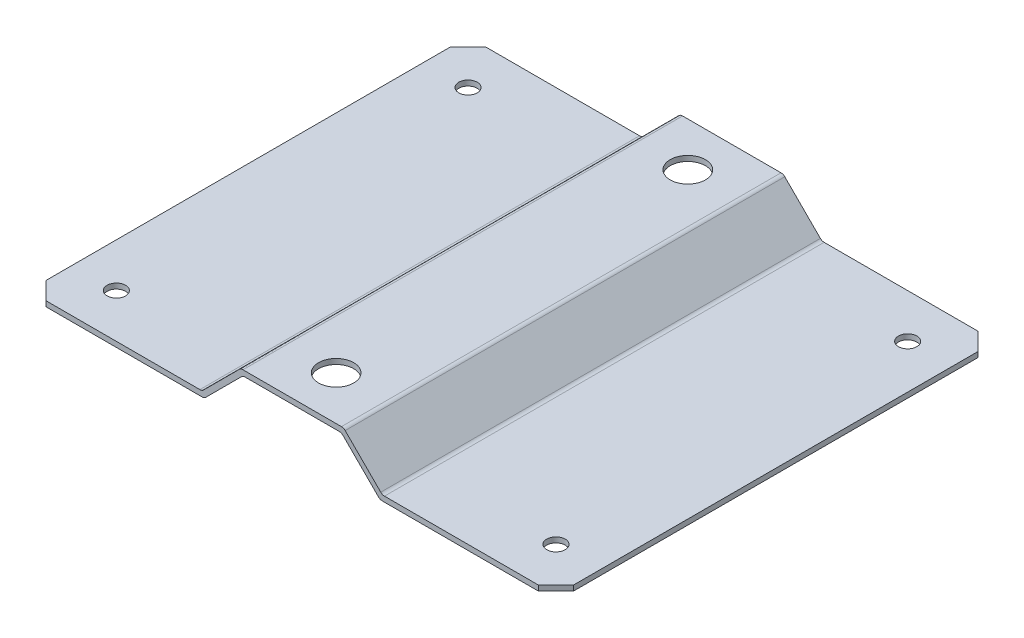
ISO-10303-21;
HEADER;
FILE_DESCRIPTION(('STEP AP214'),'2;1');
FILE_NAME('part.step','',(''),(''),'','','');
FILE_SCHEMA(('AUTOMOTIVE_DESIGN { 1 0 10303 214 1 1 1 1 }'));
ENDSEC;
DATA;
#1=APPLICATION_CONTEXT('core data for automotive mechanical design processes');
#2=APPLICATION_PROTOCOL_DEFINITION('international standard','automotive_design',2000,#1);
#3=PRODUCT_CONTEXT('',#1,'mechanical');
#4=PRODUCT('Part','Part','',(#3));
#5=PRODUCT_RELATED_PRODUCT_CATEGORY('part','',(#4));
#6=PRODUCT_DEFINITION_FORMATION('','',#4);
#7=PRODUCT_DEFINITION_CONTEXT('part definition',#1,'design');
#8=PRODUCT_DEFINITION('design','',#6,#7);
#9=PRODUCT_DEFINITION_SHAPE('','',#8);
#10=(LENGTH_UNIT() NAMED_UNIT(*) SI_UNIT(.MILLI.,.METRE.));
#11=(NAMED_UNIT(*) PLANE_ANGLE_UNIT() SI_UNIT($,.RADIAN.));
#12=(NAMED_UNIT(*) SI_UNIT($,.STERADIAN.) SOLID_ANGLE_UNIT());
#13=UNCERTAINTY_MEASURE_WITH_UNIT(LENGTH_MEASURE(1.E-05),#10,'distance_accuracy_value','');
#14=(GEOMETRIC_REPRESENTATION_CONTEXT(3) GLOBAL_UNCERTAINTY_ASSIGNED_CONTEXT((#13)) GLOBAL_UNIT_ASSIGNED_CONTEXT((#10,
#11,#12)) REPRESENTATION_CONTEXT('',''));
#15=CARTESIAN_POINT('',(0.,0.,0.));
#16=DIRECTION('',(0.,0.,1.));
#17=DIRECTION('',(1.,0.,0.));
#18=AXIS2_PLACEMENT_3D('',#15,#16,#17);
#19=CARTESIAN_POINT('',(0.,3.,250.));
#20=DIRECTION('',(1.,0.,0.));
#21=DIRECTION('',(0.,0.,-1.));
#22=AXIS2_PLACEMENT_3D('',#19,#20,#21);
#23=PLANE('',#22);
#24=DIRECTION('',(0.,0.,-1.));
#25=VECTOR('',#24,1.);
#26=CARTESIAN_POINT('',(0.,3.,250.));
#27=LINE('',#26,#25);
#28=CARTESIAN_POINT('',(0.,3.,240.));
#29=VERTEX_POINT('',#28);
#30=CARTESIAN_POINT('',(0.,3.,10.));
#31=VERTEX_POINT('',#30);
#32=EDGE_CURVE('E247',#29,#31,#27,.T.);
#33=ORIENTED_EDGE('',*,*,#32,.T.);
#34=DIRECTION('',(0.,-1.,0.));
#35=VECTOR('',#34,1.);
#36=CARTESIAN_POINT('',(0.,3.,10.));
#37=LINE('',#36,#35);
#38=CARTESIAN_POINT('',(0.,0.,10.));
#39=VERTEX_POINT('',#38);
#40=EDGE_CURVE('E349',#31,#39,#37,.T.);
#41=ORIENTED_EDGE('',*,*,#40,.T.);
#42=DIRECTION('',(0.,0.,-1.));
#43=VECTOR('',#42,1.);
#44=CARTESIAN_POINT('',(0.,0.,250.));
#45=LINE('',#44,#43);
#46=CARTESIAN_POINT('',(0.,0.,240.));
#47=VERTEX_POINT('',#46);
#48=EDGE_CURVE('E220',#47,#39,#45,.T.);
#49=ORIENTED_EDGE('',*,*,#48,.F.);
#50=DIRECTION('',(0.,1.,0.));
#51=VECTOR('',#50,1.);
#52=CARTESIAN_POINT('',(0.,3.,240.));
#53=LINE('',#52,#51);
#54=EDGE_CURVE('E347',#47,#29,#53,.T.);
#55=ORIENTED_EDGE('',*,*,#54,.T.);
#56=EDGE_LOOP('',(#33,#41,#49,#55));
#57=FACE_BOUND('',#56,.T.);
#58=ADVANCED_FACE('F35',(#57),#23,.F.);
#59=CARTESIAN_POINT('',(0.,0.,250.));
#60=DIRECTION('',(0.,1.,0.));
#61=DIRECTION('',(-1.,0.,0.));
#62=AXIS2_PLACEMENT_3D('',#59,#60,#61);
#63=PLANE('',#62);
#64=CARTESIAN_POINT('',(25.,0.,225.));
#65=DIRECTION('',(0.,-1.,0.));
#66=DIRECTION('',(0.,0.,-1.));
#67=AXIS2_PLACEMENT_3D('',#64,#65,#66);
#68=CIRCLE('',#67,5.25);
#69=CARTESIAN_POINT('',(25.,0.,219.75));
#70=VERTEX_POINT('',#69);
#71=EDGE_CURVE('E440',#70,#70,#68,.T.);
#72=ORIENTED_EDGE('',*,*,#71,.F.);
#73=EDGE_LOOP('',(#72));
#74=FACE_BOUND('',#73,.T.);
#75=CARTESIAN_POINT('',(25.,0.,25.));
#76=DIRECTION('',(0.,-1.,0.));
#77=DIRECTION('',(0.,0.,-1.));
#78=AXIS2_PLACEMENT_3D('',#75,#76,#77);
#79=CIRCLE('',#78,5.25);
#80=CARTESIAN_POINT('',(25.,0.,19.75));
#81=VERTEX_POINT('',#80);
#82=EDGE_CURVE('E434',#81,#81,#79,.T.);
#83=ORIENTED_EDGE('',*,*,#82,.F.);
#84=EDGE_LOOP('',(#83));
#85=FACE_BOUND('',#84,.T.);
#86=ORIENTED_EDGE('',*,*,#48,.T.);
#87=DIRECTION('',(-0.707106781186549,0.,0.707106781186546));
#88=VECTOR('',#87,1.);
#89=CARTESIAN_POINT('',(0.,0.,10.));
#90=LINE('',#89,#88);
#91=CARTESIAN_POINT('',(10.0000000000001,0.,0.));
#92=VERTEX_POINT('',#91);
#93=EDGE_CURVE('E353',#39,#92,#90,.F.);
#94=ORIENTED_EDGE('',*,*,#93,.T.);
#95=DIRECTION('',(1.,0.,0.));
#96=VECTOR('',#95,1.);
#97=CARTESIAN_POINT('',(0.,0.,0.));
#98=LINE('',#97,#96);
#99=CARTESIAN_POINT('',(98.7573593128807,0.,0.));
#100=VERTEX_POINT('',#99);
#101=EDGE_CURVE('E385',#92,#100,#98,.T.);
#102=ORIENTED_EDGE('',*,*,#101,.T.);
#103=DIRECTION('',(0.,0.,-1.));
#104=VECTOR('',#103,1.);
#105=CARTESIAN_POINT('',(98.7573593128807,0.,250.));
#106=LINE('',#105,#104);
#107=CARTESIAN_POINT('',(98.7573593128807,0.,250.));
#108=VERTEX_POINT('',#107);
#109=EDGE_CURVE('E290',#100,#108,#106,.F.);
#110=ORIENTED_EDGE('',*,*,#109,.T.);
#111=DIRECTION('',(1.,0.,0.));
#112=VECTOR('',#111,1.);
#113=CARTESIAN_POINT('',(0.,0.,250.));
#114=LINE('',#113,#112);
#115=CARTESIAN_POINT('',(10.,0.,250.));
#116=VERTEX_POINT('',#115);
#117=EDGE_CURVE('E246',#116,#108,#114,.T.);
#118=ORIENTED_EDGE('',*,*,#117,.F.);
#119=DIRECTION('',(-0.707106781186546,0.,-0.707106781186549));
#120=VECTOR('',#119,1.);
#121=CARTESIAN_POINT('',(10.,0.,250.));
#122=LINE('',#121,#120);
#123=EDGE_CURVE('E58',#116,#47,#122,.T.);
#124=ORIENTED_EDGE('',*,*,#123,.T.);
#125=EDGE_LOOP('',(#86,#94,#102,#110,#118,#124));
#126=FACE_BOUND('',#125,.T.);
#127=ADVANCED_FACE('F447',(#74,#85,#126),#63,.F.);
#128=CARTESIAN_POINT('',(100.,0.,250.));
#129=DIRECTION('',(-0.707106781186549,0.707106781186546,0.));
#130=DIRECTION('',(-0.707106781186546,-0.707106781186549,0.));
#131=AXIS2_PLACEMENT_3D('',#128,#129,#130);
#132=PLANE('',#131);
#133=DIRECTION('',(0.707106781186546,0.707106781186549,0.));
#134=VECTOR('',#133,1.);
#135=CARTESIAN_POINT('',(100.,0.,0.));
#136=LINE('',#135,#134);
#137=CARTESIAN_POINT('',(100.87867965644,0.878679656440359,0.));
#138=VERTEX_POINT('',#137);
#139=CARTESIAN_POINT('',(121.12132034356,21.1213203435596,0.));
#140=VERTEX_POINT('',#139);
#141=EDGE_CURVE('E387',#138,#140,#136,.T.);
#142=ORIENTED_EDGE('',*,*,#141,.T.);
#143=DIRECTION('',(0.,0.,-1.));
#144=VECTOR('',#143,1.);
#145=CARTESIAN_POINT('',(121.12132034356,21.1213203435596,250.));
#146=LINE('',#145,#144);
#147=CARTESIAN_POINT('',(121.12132034356,21.1213203435596,250.));
#148=VERTEX_POINT('',#147);
#149=EDGE_CURVE('E288',#140,#148,#146,.F.);
#150=ORIENTED_EDGE('',*,*,#149,.T.);
#151=DIRECTION('',(0.707106781186546,0.707106781186549,0.));
#152=VECTOR('',#151,1.);
#153=CARTESIAN_POINT('',(100.,0.,250.));
#154=LINE('',#153,#152);
#155=CARTESIAN_POINT('',(100.87867965644,0.878679656440359,250.));
#156=VERTEX_POINT('',#155);
#157=EDGE_CURVE('E407',#156,#148,#154,.T.);
#158=ORIENTED_EDGE('',*,*,#157,.F.);
#159=DIRECTION('',(0.,0.,-1.));
#160=VECTOR('',#159,1.);
#161=CARTESIAN_POINT('',(100.87867965644,0.878679656440359,250.));
#162=LINE('',#161,#160);
#163=EDGE_CURVE('E285',#156,#138,#162,.T.);
#164=ORIENTED_EDGE('',*,*,#163,.T.);
#165=EDGE_LOOP('',(#142,#150,#158,#164));
#166=FACE_BOUND('',#165,.T.);
#167=ADVANCED_FACE('F450',(#166),#132,.F.);
#168=CARTESIAN_POINT('',(122.,22.,250.));
#169=DIRECTION('',(0.,1.,0.));
#170=DIRECTION('',(0.,0.,1.));
#171=AXIS2_PLACEMENT_3D('',#168,#169,#170);
#172=PLANE('',#171);
#173=CARTESIAN_POINT('',(150.,22.,225.));
#174=DIRECTION('',(0.,-1.,0.));
#175=DIRECTION('',(0.,0.,-1.));
#176=AXIS2_PLACEMENT_3D('',#173,#174,#175);
#177=CIRCLE('',#176,9.99999999999998);
#178=CARTESIAN_POINT('',(150.,22.,215.));
#179=VERTEX_POINT('',#178);
#180=EDGE_CURVE('E262',#179,#179,#177,.T.);
#181=ORIENTED_EDGE('',*,*,#180,.F.);
#182=EDGE_LOOP('',(#181));
#183=FACE_BOUND('',#182,.T.);
#184=CARTESIAN_POINT('',(150.,22.,25.));
#185=DIRECTION('',(0.,-1.,0.));
#186=DIRECTION('',(0.,0.,-1.));
#187=AXIS2_PLACEMENT_3D('',#184,#185,#186);
#188=CIRCLE('',#187,9.99999999999998);
#189=CARTESIAN_POINT('',(150.,22.,15.));
#190=VERTEX_POINT('',#189);
#191=EDGE_CURVE('E261',#190,#190,#188,.T.);
#192=ORIENTED_EDGE('',*,*,#191,.F.);
#193=EDGE_LOOP('',(#192));
#194=FACE_BOUND('',#193,.T.);
#195=DIRECTION('',(1.,0.,0.));
#196=VECTOR('',#195,1.);
#197=CARTESIAN_POINT('',(122.,22.,0.));
#198=LINE('',#197,#196);
#199=CARTESIAN_POINT('',(123.242640687119,22.,0.));
#200=VERTEX_POINT('',#199);
#201=CARTESIAN_POINT('',(176.757359312881,22.,0.));
#202=VERTEX_POINT('',#201);
#203=EDGE_CURVE('E231',#200,#202,#198,.T.);
#204=ORIENTED_EDGE('',*,*,#203,.T.);
#205=DIRECTION('',(0.,0.,-1.));
#206=VECTOR('',#205,1.);
#207=CARTESIAN_POINT('',(176.757359312881,22.,250.));
#208=LINE('',#207,#206);
#209=CARTESIAN_POINT('',(176.757359312881,22.,250.));
#210=VERTEX_POINT('',#209);
#211=EDGE_CURVE('E283',#202,#210,#208,.F.);
#212=ORIENTED_EDGE('',*,*,#211,.T.);
#213=DIRECTION('',(1.,0.,0.));
#214=VECTOR('',#213,1.);
#215=CARTESIAN_POINT('',(122.,22.,250.));
#216=LINE('',#215,#214);
#217=CARTESIAN_POINT('',(123.242640687119,22.,250.));
#218=VERTEX_POINT('',#217);
#219=EDGE_CURVE('E404',#218,#210,#216,.T.);
#220=ORIENTED_EDGE('',*,*,#219,.F.);
#221=DIRECTION('',(0.,0.,-1.));
#222=VECTOR('',#221,1.);
#223=CARTESIAN_POINT('',(123.242640687119,22.,0.));
#224=LINE('',#223,#222);
#225=EDGE_CURVE('E280',#218,#200,#224,.T.);
#226=ORIENTED_EDGE('',*,*,#225,.T.);
#227=EDGE_LOOP('',(#204,#212,#220,#226));
#228=FACE_BOUND('',#227,.T.);
#229=ADVANCED_FACE('F394',(#183,#194,#228),#172,.F.);
#230=CARTESIAN_POINT('',(178.,22.,250.));
#231=DIRECTION('',(0.707106781186548,0.707106781186547,0.));
#232=DIRECTION('',(-0.707106781186547,0.707106781186548,0.));
#233=AXIS2_PLACEMENT_3D('',#230,#231,#232);
#234=PLANE('',#233);
#235=DIRECTION('',(0.707106781186547,-0.707106781186548,0.));
#236=VECTOR('',#235,1.);
#237=CARTESIAN_POINT('',(178.,22.,0.));
#238=LINE('',#237,#236);
#239=CARTESIAN_POINT('',(178.87867965644,21.1213203435596,0.));
#240=VERTEX_POINT('',#239);
#241=CARTESIAN_POINT('',(199.12132034356,0.878679656440361,0.));
#242=VERTEX_POINT('',#241);
#243=EDGE_CURVE('E227',#240,#242,#238,.T.);
#244=ORIENTED_EDGE('',*,*,#243,.T.);
#245=DIRECTION('',(0.,0.,-1.));
#246=VECTOR('',#245,1.);
#247=CARTESIAN_POINT('',(199.12132034356,0.878679656440368,250.));
#248=LINE('',#247,#246);
#249=CARTESIAN_POINT('',(199.12132034356,0.878679656440361,250.));
#250=VERTEX_POINT('',#249);
#251=EDGE_CURVE('E203',#242,#250,#248,.F.);
#252=ORIENTED_EDGE('',*,*,#251,.T.);
#253=DIRECTION('',(0.707106781186547,-0.707106781186548,0.));
#254=VECTOR('',#253,1.);
#255=CARTESIAN_POINT('',(178.,22.,250.));
#256=LINE('',#255,#254);
#257=CARTESIAN_POINT('',(178.87867965644,21.1213203435596,250.));
#258=VERTEX_POINT('',#257);
#259=EDGE_CURVE('E375',#258,#250,#256,.T.);
#260=ORIENTED_EDGE('',*,*,#259,.F.);
#261=DIRECTION('',(0.,0.,-1.));
#262=VECTOR('',#261,1.);
#263=CARTESIAN_POINT('',(178.87867965644,21.1213203435596,0.));
#264=LINE('',#263,#262);
#265=EDGE_CURVE('E208',#258,#240,#264,.T.);
#266=ORIENTED_EDGE('',*,*,#265,.T.);
#267=EDGE_LOOP('',(#244,#252,#260,#266));
#268=FACE_BOUND('',#267,.T.);
#269=ADVANCED_FACE('F406',(#268),#234,.F.);
#270=CARTESIAN_POINT('',(200.,0.,250.));
#271=DIRECTION('',(0.,1.,0.));
#272=DIRECTION('',(-1.,0.,0.));
#273=AXIS2_PLACEMENT_3D('',#270,#271,#272);
#274=PLANE('',#273);
#275=CARTESIAN_POINT('',(275.,0.,225.));
#276=DIRECTION('',(0.,-1.,0.));
#277=DIRECTION('',(0.,0.,-1.));
#278=AXIS2_PLACEMENT_3D('',#275,#276,#277);
#279=CIRCLE('',#278,5.24999999999998);
#280=CARTESIAN_POINT('',(275.,0.,219.75));
#281=VERTEX_POINT('',#280);
#282=EDGE_CURVE('E428',#281,#281,#279,.T.);
#283=ORIENTED_EDGE('',*,*,#282,.F.);
#284=EDGE_LOOP('',(#283));
#285=FACE_BOUND('',#284,.T.);
#286=CARTESIAN_POINT('',(275.,0.,25.));
#287=DIRECTION('',(0.,-1.,0.));
#288=DIRECTION('',(0.,0.,-1.));
#289=AXIS2_PLACEMENT_3D('',#286,#287,#288);
#290=CIRCLE('',#289,5.24999999999998);
#291=CARTESIAN_POINT('',(275.,0.,19.75));
#292=VERTEX_POINT('',#291);
#293=EDGE_CURVE('E422',#292,#292,#290,.T.);
#294=ORIENTED_EDGE('',*,*,#293,.F.);
#295=EDGE_LOOP('',(#294));
#296=FACE_BOUND('',#295,.T.);
#297=DIRECTION('',(1.,0.,0.));
#298=VECTOR('',#297,1.);
#299=CARTESIAN_POINT('',(200.,0.,0.));
#300=LINE('',#299,#298);
#301=CARTESIAN_POINT('',(201.242640687119,0.,0.));
#302=VERTEX_POINT('',#301);
#303=CARTESIAN_POINT('',(290.,0.,0.));
#304=VERTEX_POINT('',#303);
#305=EDGE_CURVE('E215',#302,#304,#300,.T.);
#306=ORIENTED_EDGE('',*,*,#305,.T.);
#307=DIRECTION('',(-0.707106781186549,0.,-0.707106781186546));
#308=VECTOR('',#307,1.);
#309=CARTESIAN_POINT('',(300.,0.,10.));
#310=LINE('',#309,#308);
#311=CARTESIAN_POINT('',(300.,0.,10.));
#312=VERTEX_POINT('',#311);
#313=EDGE_CURVE('E345',#304,#312,#310,.F.);
#314=ORIENTED_EDGE('',*,*,#313,.T.);
#315=DIRECTION('',(0.,0.,-1.));
#316=VECTOR('',#315,1.);
#317=CARTESIAN_POINT('',(300.,0.,250.));
#318=LINE('',#317,#316);
#319=CARTESIAN_POINT('',(300.,0.,240.));
#320=VERTEX_POINT('',#319);
#321=EDGE_CURVE('E254',#320,#312,#318,.T.);
#322=ORIENTED_EDGE('',*,*,#321,.F.);
#323=DIRECTION('',(-0.707106781186546,0.,0.707106781186549));
#324=VECTOR('',#323,1.);
#325=CARTESIAN_POINT('',(290.,0.,250.));
#326=LINE('',#325,#324);
#327=CARTESIAN_POINT('',(290.,0.,250.));
#328=VERTEX_POINT('',#327);
#329=EDGE_CURVE('E343',#320,#328,#326,.T.);
#330=ORIENTED_EDGE('',*,*,#329,.T.);
#331=DIRECTION('',(1.,0.,0.));
#332=VECTOR('',#331,1.);
#333=CARTESIAN_POINT('',(200.,0.,250.));
#334=LINE('',#333,#332);
#335=CARTESIAN_POINT('',(201.242640687119,0.,250.));
#336=VERTEX_POINT('',#335);
#337=EDGE_CURVE('E218',#336,#328,#334,.T.);
#338=ORIENTED_EDGE('',*,*,#337,.F.);
#339=DIRECTION('',(0.,0.,-1.));
#340=VECTOR('',#339,1.);
#341=CARTESIAN_POINT('',(201.242640687119,0.,250.));
#342=LINE('',#341,#340);
#343=EDGE_CURVE('E202',#336,#302,#342,.T.);
#344=ORIENTED_EDGE('',*,*,#343,.T.);
#345=EDGE_LOOP('',(#306,#314,#322,#330,#338,#344));
#346=FACE_BOUND('',#345,.T.);
#347=ADVANCED_FACE('F214',(#285,#296,#346),#274,.F.);
#348=CARTESIAN_POINT('',(300.,0.,250.));
#349=DIRECTION('',(-1.,0.,0.));
#350=DIRECTION('',(0.,0.,1.));
#351=AXIS2_PLACEMENT_3D('',#348,#349,#350);
#352=PLANE('',#351);
#353=ORIENTED_EDGE('',*,*,#321,.T.);
#354=DIRECTION('',(0.,1.,0.));
#355=VECTOR('',#354,1.);
#356=CARTESIAN_POINT('',(300.,0.,10.));
#357=LINE('',#356,#355);
#358=CARTESIAN_POINT('',(300.,3.00000000000001,10.));
#359=VERTEX_POINT('',#358);
#360=EDGE_CURVE('E333',#312,#359,#357,.T.);
#361=ORIENTED_EDGE('',*,*,#360,.T.);
#362=DIRECTION('',(0.,0.,-1.));
#363=VECTOR('',#362,1.);
#364=CARTESIAN_POINT('',(300.,3.00000000000001,250.));
#365=LINE('',#364,#363);
#366=CARTESIAN_POINT('',(300.,3.00000000000001,240.));
#367=VERTEX_POINT('',#366);
#368=EDGE_CURVE('E250',#367,#359,#365,.T.);
#369=ORIENTED_EDGE('',*,*,#368,.F.);
#370=DIRECTION('',(0.,-1.,0.));
#371=VECTOR('',#370,1.);
#372=CARTESIAN_POINT('',(300.,0.,240.));
#373=LINE('',#372,#371);
#374=EDGE_CURVE('E331',#367,#320,#373,.T.);
#375=ORIENTED_EDGE('',*,*,#374,.T.);
#376=EDGE_LOOP('',(#353,#361,#369,#375));
#377=FACE_BOUND('',#376,.T.);
#378=ADVANCED_FACE('F513',(#377),#352,.F.);
#379=CARTESIAN_POINT('',(300.,3.00000000000001,250.));
#380=DIRECTION('',(0.,-1.,0.));
#381=DIRECTION('',(1.,0.,0.));
#382=AXIS2_PLACEMENT_3D('',#379,#380,#381);
#383=PLANE('',#382);
#384=CARTESIAN_POINT('',(275.,3.00000000000001,225.));
#385=DIRECTION('',(0.,-1.,0.));
#386=DIRECTION('',(1.,0.,0.));
#387=AXIS2_PLACEMENT_3D('',#384,#385,#386);
#388=CIRCLE('',#387,5.24999999999998);
#389=CARTESIAN_POINT('',(280.25,3.00000000000001,225.));
#390=VERTEX_POINT('',#389);
#391=EDGE_CURVE('E425',#390,#390,#388,.T.);
#392=ORIENTED_EDGE('',*,*,#391,.T.);
#393=EDGE_LOOP('',(#392));
#394=FACE_BOUND('',#393,.T.);
#395=CARTESIAN_POINT('',(275.,3.00000000000001,25.));
#396=DIRECTION('',(0.,-1.,0.));
#397=DIRECTION('',(1.,0.,0.));
#398=AXIS2_PLACEMENT_3D('',#395,#396,#397);
#399=CIRCLE('',#398,5.24999999999998);
#400=CARTESIAN_POINT('',(280.25,3.00000000000001,25.));
#401=VERTEX_POINT('',#400);
#402=EDGE_CURVE('E419',#401,#401,#399,.T.);
#403=ORIENTED_EDGE('',*,*,#402,.T.);
#404=EDGE_LOOP('',(#403));
#405=FACE_BOUND('',#404,.T.);
#406=ORIENTED_EDGE('',*,*,#368,.T.);
#407=DIRECTION('',(0.707106781186549,0.,0.707106781186546));
#408=VECTOR('',#407,1.);
#409=CARTESIAN_POINT('',(300.,3.00000000000001,10.));
#410=LINE('',#409,#408);
#411=CARTESIAN_POINT('',(290.,3.00000000000001,0.));
#412=VERTEX_POINT('',#411);
#413=EDGE_CURVE('E338',#359,#412,#410,.F.);
#414=ORIENTED_EDGE('',*,*,#413,.T.);
#415=DIRECTION('',(-1.,0.,0.));
#416=VECTOR('',#415,1.);
#417=CARTESIAN_POINT('',(300.,3.00000000000001,0.));
#418=LINE('',#417,#416);
#419=CARTESIAN_POINT('',(202.485281374238,2.99999999999999,0.));
#420=VERTEX_POINT('',#419);
#421=EDGE_CURVE('E226',#412,#420,#418,.T.);
#422=ORIENTED_EDGE('',*,*,#421,.T.);
#423=DIRECTION('',(0.,0.,-1.));
#424=VECTOR('',#423,1.);
#425=CARTESIAN_POINT('',(202.485281374238,2.99999999999999,250.));
#426=LINE('',#425,#424);
#427=CARTESIAN_POINT('',(202.485281374238,2.99999999999999,250.));
#428=VERTEX_POINT('',#427);
#429=EDGE_CURVE('E298',#420,#428,#426,.F.);
#430=ORIENTED_EDGE('',*,*,#429,.T.);
#431=DIRECTION('',(-1.,0.,0.));
#432=VECTOR('',#431,1.);
#433=CARTESIAN_POINT('',(300.,3.00000000000001,250.));
#434=LINE('',#433,#432);
#435=CARTESIAN_POINT('',(290.,3.00000000000001,250.));
#436=VERTEX_POINT('',#435);
#437=EDGE_CURVE('E362',#436,#428,#434,.T.);
#438=ORIENTED_EDGE('',*,*,#437,.F.);
#439=DIRECTION('',(0.707106781186546,0.,-0.707106781186549));
#440=VECTOR('',#439,1.);
#441=CARTESIAN_POINT('',(290.,3.00000000000001,250.));
#442=LINE('',#441,#440);
#443=EDGE_CURVE('E336',#436,#367,#442,.T.);
#444=ORIENTED_EDGE('',*,*,#443,.T.);
#445=EDGE_LOOP('',(#406,#414,#422,#430,#438,#444));
#446=FACE_BOUND('',#445,.T.);
#447=ADVANCED_FACE('F366',(#394,#405,#446),#383,.F.);
#448=CARTESIAN_POINT('',(201.242640687119,2.99999999999999,250.));
#449=DIRECTION('',(-0.707106781186548,-0.707106781186547,0.));
#450=DIRECTION('',(0.707106781186547,-0.707106781186548,0.));
#451=AXIS2_PLACEMENT_3D('',#448,#449,#450);
#452=PLANE('',#451);
#453=DIRECTION('',(-0.707106781186547,0.707106781186548,0.));
#454=VECTOR('',#453,1.);
#455=CARTESIAN_POINT('',(201.242640687119,2.99999999999999,250.));
#456=LINE('',#455,#454);
#457=CARTESIAN_POINT('',(200.363961030679,3.87867965644036,250.));
#458=VERTEX_POINT('',#457);
#459=CARTESIAN_POINT('',(180.12132034356,24.1213203435596,250.));
#460=VERTEX_POINT('',#459);
#461=EDGE_CURVE('E370',#458,#460,#456,.T.);
#462=ORIENTED_EDGE('',*,*,#461,.F.);
#463=DIRECTION('',(0.,0.,-1.));
#464=VECTOR('',#463,1.);
#465=CARTESIAN_POINT('',(200.363961030679,3.87867965644036,0.));
#466=LINE('',#465,#464);
#467=CARTESIAN_POINT('',(200.363961030679,3.87867965644036,0.));
#468=VERTEX_POINT('',#467);
#469=EDGE_CURVE('E295',#458,#468,#466,.T.);
#470=ORIENTED_EDGE('',*,*,#469,.T.);
#471=DIRECTION('',(-0.707106781186547,0.707106781186548,0.));
#472=VECTOR('',#471,1.);
#473=CARTESIAN_POINT('',(201.242640687119,2.99999999999999,0.));
#474=LINE('',#473,#472);
#475=CARTESIAN_POINT('',(180.12132034356,24.1213203435596,0.));
#476=VERTEX_POINT('',#475);
#477=EDGE_CURVE('E229',#468,#476,#474,.T.);
#478=ORIENTED_EDGE('',*,*,#477,.T.);
#479=DIRECTION('',(0.,0.,-1.));
#480=VECTOR('',#479,1.);
#481=CARTESIAN_POINT('',(180.12132034356,24.1213203435596,250.));
#482=LINE('',#481,#480);
#483=EDGE_CURVE('E293',#476,#460,#482,.F.);
#484=ORIENTED_EDGE('',*,*,#483,.T.);
#485=EDGE_LOOP('',(#462,#470,#478,#484));
#486=FACE_BOUND('',#485,.T.);
#487=ADVANCED_FACE('F504',(#486),#452,.F.);
#488=CARTESIAN_POINT('',(179.242640687119,25.,250.));
#489=DIRECTION('',(0.,-1.,0.));
#490=DIRECTION('',(1.,0.,0.));
#491=AXIS2_PLACEMENT_3D('',#488,#489,#490);
#492=PLANE('',#491);
#493=CARTESIAN_POINT('',(150.,25.,225.));
#494=DIRECTION('',(0.,-1.,0.));
#495=DIRECTION('',(1.,0.,0.));
#496=AXIS2_PLACEMENT_3D('',#493,#494,#495);
#497=CIRCLE('',#496,9.99999999999998);
#498=CARTESIAN_POINT('',(160.,25.,225.));
#499=VERTEX_POINT('',#498);
#500=EDGE_CURVE('E259',#499,#499,#497,.T.);
#501=ORIENTED_EDGE('',*,*,#500,.T.);
#502=EDGE_LOOP('',(#501));
#503=FACE_BOUND('',#502,.T.);
#504=CARTESIAN_POINT('',(150.,25.,25.));
#505=DIRECTION('',(0.,-1.,0.));
#506=DIRECTION('',(1.,0.,0.));
#507=AXIS2_PLACEMENT_3D('',#504,#505,#506);
#508=CIRCLE('',#507,9.99999999999998);
#509=CARTESIAN_POINT('',(160.,25.,25.));
#510=VERTEX_POINT('',#509);
#511=EDGE_CURVE('E388',#510,#510,#508,.T.);
#512=ORIENTED_EDGE('',*,*,#511,.T.);
#513=EDGE_LOOP('',(#512));
#514=FACE_BOUND('',#513,.T.);
#515=DIRECTION('',(-1.,0.,0.));
#516=VECTOR('',#515,1.);
#517=CARTESIAN_POINT('',(179.242640687119,25.,250.));
#518=LINE('',#517,#516);
#519=CARTESIAN_POINT('',(178.,25.,250.));
#520=VERTEX_POINT('',#519);
#521=CARTESIAN_POINT('',(122.,25.,250.));
#522=VERTEX_POINT('',#521);
#523=EDGE_CURVE('E373',#520,#522,#518,.T.);
#524=ORIENTED_EDGE('',*,*,#523,.F.);
#525=DIRECTION('',(0.,0.,-1.));
#526=VECTOR('',#525,1.);
#527=CARTESIAN_POINT('',(178.,25.,250.));
#528=LINE('',#527,#526);
#529=CARTESIAN_POINT('',(178.,25.,0.));
#530=VERTEX_POINT('',#529);
#531=EDGE_CURVE('E303',#520,#530,#528,.T.);
#532=ORIENTED_EDGE('',*,*,#531,.T.);
#533=DIRECTION('',(-1.,0.,0.));
#534=VECTOR('',#533,1.);
#535=CARTESIAN_POINT('',(179.242640687119,25.,0.));
#536=LINE('',#535,#534);
#537=CARTESIAN_POINT('',(122.,25.,0.));
#538=VERTEX_POINT('',#537);
#539=EDGE_CURVE('E237',#530,#538,#536,.T.);
#540=ORIENTED_EDGE('',*,*,#539,.T.);
#541=DIRECTION('',(0.,0.,-1.));
#542=VECTOR('',#541,1.);
#543=CARTESIAN_POINT('',(122.,25.,250.));
#544=LINE('',#543,#542);
#545=EDGE_CURVE('E301',#538,#522,#544,.F.);
#546=ORIENTED_EDGE('',*,*,#545,.T.);
#547=EDGE_LOOP('',(#524,#532,#540,#546));
#548=FACE_BOUND('',#547,.T.);
#549=ADVANCED_FACE('F495',(#503,#514,#548),#492,.F.);
#550=CARTESIAN_POINT('',(120.757359312881,25.,250.));
#551=DIRECTION('',(0.707106781186549,-0.707106781186546,0.));
#552=DIRECTION('',(0.707106781186546,0.707106781186549,0.));
#553=AXIS2_PLACEMENT_3D('',#550,#551,#552);
#554=PLANE('',#553);
#555=DIRECTION('',(-0.707106781186546,-0.707106781186549,0.));
#556=VECTOR('',#555,1.);
#557=CARTESIAN_POINT('',(120.757359312881,25.,0.));
#558=LINE('',#557,#556);
#559=CARTESIAN_POINT('',(119.87867965644,24.1213203435596,0.));
#560=VERTEX_POINT('',#559);
#561=CARTESIAN_POINT('',(99.636038969321,3.87867965644036,0.));
#562=VERTEX_POINT('',#561);
#563=EDGE_CURVE('E240',#560,#562,#558,.T.);
#564=ORIENTED_EDGE('',*,*,#563,.T.);
#565=DIRECTION('',(0.,0.,-1.));
#566=VECTOR('',#565,1.);
#567=CARTESIAN_POINT('',(99.636038969321,3.87867965644036,250.));
#568=LINE('',#567,#566);
#569=CARTESIAN_POINT('',(99.636038969321,3.87867965644036,250.));
#570=VERTEX_POINT('',#569);
#571=EDGE_CURVE('E312',#562,#570,#568,.F.);
#572=ORIENTED_EDGE('',*,*,#571,.T.);
#573=DIRECTION('',(-0.707106781186546,-0.707106781186549,0.));
#574=VECTOR('',#573,1.);
#575=CARTESIAN_POINT('',(120.757359312881,25.,250.));
#576=LINE('',#575,#574);
#577=CARTESIAN_POINT('',(119.87867965644,24.1213203435596,250.));
#578=VERTEX_POINT('',#577);
#579=EDGE_CURVE('E381',#578,#570,#576,.T.);
#580=ORIENTED_EDGE('',*,*,#579,.F.);
#581=DIRECTION('',(0.,0.,-1.));
#582=VECTOR('',#581,1.);
#583=CARTESIAN_POINT('',(119.87867965644,24.1213203435596,250.));
#584=LINE('',#583,#582);
#585=EDGE_CURVE('E309',#578,#560,#584,.T.);
#586=ORIENTED_EDGE('',*,*,#585,.T.);
#587=EDGE_LOOP('',(#564,#572,#580,#586));
#588=FACE_BOUND('',#587,.T.);
#589=ADVANCED_FACE('F483',(#588),#554,.F.);
#590=CARTESIAN_POINT('',(98.7573593128807,3.00000000000001,250.));
#591=DIRECTION('',(0.,-1.,0.));
#592=DIRECTION('',(1.,0.,0.));
#593=AXIS2_PLACEMENT_3D('',#590,#591,#592);
#594=PLANE('',#593);
#595=CARTESIAN_POINT('',(25.,3.,225.));
#596=DIRECTION('',(0.,-1.,0.));
#597=DIRECTION('',(1.,0.,0.));
#598=AXIS2_PLACEMENT_3D('',#595,#596,#597);
#599=CIRCLE('',#598,5.25);
#600=CARTESIAN_POINT('',(30.25,3.,225.));
#601=VERTEX_POINT('',#600);
#602=EDGE_CURVE('E437',#601,#601,#599,.T.);
#603=ORIENTED_EDGE('',*,*,#602,.T.);
#604=EDGE_LOOP('',(#603));
#605=FACE_BOUND('',#604,.T.);
#606=CARTESIAN_POINT('',(25.,3.,25.));
#607=DIRECTION('',(0.,-1.,0.));
#608=DIRECTION('',(1.,0.,0.));
#609=AXIS2_PLACEMENT_3D('',#606,#607,#608);
#610=CIRCLE('',#609,5.25);
#611=CARTESIAN_POINT('',(30.25,3.,25.));
#612=VERTEX_POINT('',#611);
#613=EDGE_CURVE('E431',#612,#612,#610,.T.);
#614=ORIENTED_EDGE('',*,*,#613,.T.);
#615=EDGE_LOOP('',(#614));
#616=FACE_BOUND('',#615,.T.);
#617=DIRECTION('',(-1.,0.,0.));
#618=VECTOR('',#617,1.);
#619=CARTESIAN_POINT('',(98.7573593128807,3.00000000000001,0.));
#620=LINE('',#619,#618);
#621=CARTESIAN_POINT('',(97.5147186257614,3.00000000000001,0.));
#622=VERTEX_POINT('',#621);
#623=CARTESIAN_POINT('',(10.0000000000001,3.,0.));
#624=VERTEX_POINT('',#623);
#625=EDGE_CURVE('E243',#622,#624,#620,.T.);
#626=ORIENTED_EDGE('',*,*,#625,.T.);
#627=DIRECTION('',(0.707106781186549,0.,-0.707106781186546));
#628=VECTOR('',#627,1.);
#629=CARTESIAN_POINT('',(0.,3.,10.));
#630=LINE('',#629,#628);
#631=EDGE_CURVE('E356',#624,#31,#630,.F.);
#632=ORIENTED_EDGE('',*,*,#631,.T.);
#633=ORIENTED_EDGE('',*,*,#32,.F.);
#634=DIRECTION('',(0.707106781186546,0.,0.707106781186549));
#635=VECTOR('',#634,1.);
#636=CARTESIAN_POINT('',(10.,3.,250.));
#637=LINE('',#636,#635);
#638=CARTESIAN_POINT('',(10.,3.,250.));
#639=VERTEX_POINT('',#638);
#640=EDGE_CURVE('E50',#29,#639,#637,.T.);
#641=ORIENTED_EDGE('',*,*,#640,.T.);
#642=DIRECTION('',(-1.,0.,0.));
#643=VECTOR('',#642,1.);
#644=CARTESIAN_POINT('',(98.7573593128807,3.00000000000001,250.));
#645=LINE('',#644,#643);
#646=CARTESIAN_POINT('',(97.5147186257614,3.00000000000001,250.));
#647=VERTEX_POINT('',#646);
#648=EDGE_CURVE('E251',#647,#639,#645,.T.);
#649=ORIENTED_EDGE('',*,*,#648,.F.);
#650=DIRECTION('',(0.,0.,-1.));
#651=VECTOR('',#650,1.);
#652=CARTESIAN_POINT('',(97.5147186257614,3.00000000000001,0.));
#653=LINE('',#652,#651);
#654=EDGE_CURVE('E306',#647,#622,#653,.T.);
#655=ORIENTED_EDGE('',*,*,#654,.T.);
#656=EDGE_LOOP('',(#626,#632,#633,#641,#649,#655));
#657=FACE_BOUND('',#656,.T.);
#658=ADVANCED_FACE('F477',(#605,#616,#657),#594,.F.);
#659=CARTESIAN_POINT('',(0.,0.,250.));
#660=DIRECTION('',(0.,0.,1.));
#661=DIRECTION('',(1.,0.,0.));
#662=AXIS2_PLACEMENT_3D('',#659,#660,#661);
#663=PLANE('',#662);
#664=ORIENTED_EDGE('',*,*,#648,.T.);
#665=DIRECTION('',(0.,-1.,0.));
#666=VECTOR('',#665,1.);
#667=CARTESIAN_POINT('',(10.,0.,250.));
#668=LINE('',#667,#666);
#669=EDGE_CURVE('E11',#639,#116,#668,.T.);
#670=ORIENTED_EDGE('',*,*,#669,.T.);
#671=ORIENTED_EDGE('',*,*,#117,.T.);
#672=CARTESIAN_POINT('',(98.7573593128807,3.,250.));
#673=DIRECTION('',(0.,0.,1.));
#674=DIRECTION('',(1.,0.,0.));
#675=AXIS2_PLACEMENT_3D('',#672,#673,#674);
#676=CIRCLE('',#675,3.);
#677=EDGE_CURVE('E276',#108,#156,#676,.T.);
#678=ORIENTED_EDGE('',*,*,#677,.T.);
#679=ORIENTED_EDGE('',*,*,#157,.T.);
#680=CARTESIAN_POINT('',(123.242640687119,19.,250.));
#681=DIRECTION('',(0.,0.,1.));
#682=DIRECTION('',(1.,0.,0.));
#683=AXIS2_PLACEMENT_3D('',#680,#681,#682);
#684=CIRCLE('',#683,3.);
#685=EDGE_CURVE('E320',#148,#218,#684,.F.);
#686=ORIENTED_EDGE('',*,*,#685,.T.);
#687=ORIENTED_EDGE('',*,*,#219,.T.);
#688=CARTESIAN_POINT('',(176.757359312881,19.,250.));
#689=DIRECTION('',(0.,0.,1.));
#690=DIRECTION('',(1.,0.,0.));
#691=AXIS2_PLACEMENT_3D('',#688,#689,#690);
#692=CIRCLE('',#691,3.);
#693=EDGE_CURVE('E316',#210,#258,#692,.F.);
#694=ORIENTED_EDGE('',*,*,#693,.T.);
#695=ORIENTED_EDGE('',*,*,#259,.T.);
#696=CARTESIAN_POINT('',(201.242640687119,3.,250.));
#697=DIRECTION('',(0.,0.,1.));
#698=DIRECTION('',(1.,0.,0.));
#699=AXIS2_PLACEMENT_3D('',#696,#697,#698);
#700=CIRCLE('',#699,3.);
#701=EDGE_CURVE('E278',#250,#336,#700,.T.);
#702=ORIENTED_EDGE('',*,*,#701,.T.);
#703=ORIENTED_EDGE('',*,*,#337,.T.);
#704=DIRECTION('',(0.,1.,0.));
#705=VECTOR('',#704,1.);
#706=CARTESIAN_POINT('',(290.,3.00000000000001,250.));
#707=LINE('',#706,#705);
#708=EDGE_CURVE('E43',#328,#436,#707,.T.);
#709=ORIENTED_EDGE('',*,*,#708,.T.);
#710=ORIENTED_EDGE('',*,*,#437,.T.);
#711=CARTESIAN_POINT('',(202.485281374238,5.99999999999999,250.));
#712=DIRECTION('',(0.,0.,1.));
#713=DIRECTION('',(1.,0.,0.));
#714=AXIS2_PLACEMENT_3D('',#711,#712,#713);
#715=CIRCLE('',#714,3.);
#716=EDGE_CURVE('E325',#428,#458,#715,.F.);
#717=ORIENTED_EDGE('',*,*,#716,.T.);
#718=ORIENTED_EDGE('',*,*,#461,.T.);
#719=CARTESIAN_POINT('',(178.,22.,250.));
#720=DIRECTION('',(0.,0.,1.));
#721=DIRECTION('',(1.,0.,0.));
#722=AXIS2_PLACEMENT_3D('',#719,#720,#721);
#723=CIRCLE('',#722,3.);
#724=EDGE_CURVE('E274',#460,#520,#723,.T.);
#725=ORIENTED_EDGE('',*,*,#724,.T.);
#726=ORIENTED_EDGE('',*,*,#523,.T.);
#727=CARTESIAN_POINT('',(122.,22.,250.));
#728=DIRECTION('',(0.,0.,1.));
#729=DIRECTION('',(1.,0.,0.));
#730=AXIS2_PLACEMENT_3D('',#727,#728,#729);
#731=CIRCLE('',#730,3.);
#732=EDGE_CURVE('E272',#522,#578,#731,.T.);
#733=ORIENTED_EDGE('',*,*,#732,.T.);
#734=ORIENTED_EDGE('',*,*,#579,.T.);
#735=CARTESIAN_POINT('',(97.5147186257614,6.00000000000001,250.));
#736=DIRECTION('',(0.,0.,1.));
#737=DIRECTION('',(1.,0.,0.));
#738=AXIS2_PLACEMENT_3D('',#735,#736,#737);
#739=CIRCLE('',#738,3.);
#740=EDGE_CURVE('E329',#570,#647,#739,.F.);
#741=ORIENTED_EDGE('',*,*,#740,.T.);
#742=EDGE_LOOP('',(#664,#670,#671,#678,#679,#686,#687,#694,#695,#702,#703,#709,#710,#717,#718,
#725,#726,#733,#734,#741));
#743=FACE_BOUND('',#742,.T.);
#744=ADVANCED_FACE('F361',(#743),#663,.T.);
#745=CARTESIAN_POINT('',(0.,0.,0.));
#746=DIRECTION('',(0.,0.,1.));
#747=DIRECTION('',(1.,0.,0.));
#748=AXIS2_PLACEMENT_3D('',#745,#746,#747);
#749=PLANE('',#748);
#750=ORIENTED_EDGE('',*,*,#421,.F.);
#751=DIRECTION('',(0.,-1.,0.));
#752=VECTOR('',#751,1.);
#753=CARTESIAN_POINT('',(290.,0.,0.));
#754=LINE('',#753,#752);
#755=EDGE_CURVE('E225',#412,#304,#754,.T.);
#756=ORIENTED_EDGE('',*,*,#755,.T.);
#757=ORIENTED_EDGE('',*,*,#305,.F.);
#758=CARTESIAN_POINT('',(201.242640687119,3.,0.));
#759=DIRECTION('',(0.,0.,1.));
#760=DIRECTION('',(1.,0.,0.));
#761=AXIS2_PLACEMENT_3D('',#758,#759,#760);
#762=CIRCLE('',#761,3.);
#763=EDGE_CURVE('E198',#302,#242,#762,.F.);
#764=ORIENTED_EDGE('',*,*,#763,.T.);
#765=ORIENTED_EDGE('',*,*,#243,.F.);
#766=CARTESIAN_POINT('',(176.757359312881,19.,0.));
#767=DIRECTION('',(0.,0.,1.));
#768=DIRECTION('',(1.,0.,0.));
#769=AXIS2_PLACEMENT_3D('',#766,#767,#768);
#770=CIRCLE('',#769,3.);
#771=EDGE_CURVE('E314',#240,#202,#770,.T.);
#772=ORIENTED_EDGE('',*,*,#771,.T.);
#773=ORIENTED_EDGE('',*,*,#203,.F.);
#774=CARTESIAN_POINT('',(123.242640687119,19.,0.));
#775=DIRECTION('',(0.,0.,1.));
#776=DIRECTION('',(1.,0.,0.));
#777=AXIS2_PLACEMENT_3D('',#774,#775,#776);
#778=CIRCLE('',#777,3.);
#779=EDGE_CURVE('E318',#200,#140,#778,.T.);
#780=ORIENTED_EDGE('',*,*,#779,.T.);
#781=ORIENTED_EDGE('',*,*,#141,.F.);
#782=CARTESIAN_POINT('',(98.7573593128807,3.,0.));
#783=DIRECTION('',(0.,0.,1.));
#784=DIRECTION('',(1.,0.,0.));
#785=AXIS2_PLACEMENT_3D('',#782,#783,#784);
#786=CIRCLE('',#785,3.);
#787=EDGE_CURVE('E209',#138,#100,#786,.F.);
#788=ORIENTED_EDGE('',*,*,#787,.T.);
#789=ORIENTED_EDGE('',*,*,#101,.F.);
#790=DIRECTION('',(0.,1.,0.));
#791=VECTOR('',#790,1.);
#792=CARTESIAN_POINT('',(10.0000000000001,0.,0.));
#793=LINE('',#792,#791);
#794=EDGE_CURVE('E340',#92,#624,#793,.T.);
#795=ORIENTED_EDGE('',*,*,#794,.T.);
#796=ORIENTED_EDGE('',*,*,#625,.F.);
#797=CARTESIAN_POINT('',(97.5147186257614,6.00000000000001,0.));
#798=DIRECTION('',(0.,0.,1.));
#799=DIRECTION('',(1.,0.,0.));
#800=AXIS2_PLACEMENT_3D('',#797,#798,#799);
#801=CIRCLE('',#800,3.);
#802=EDGE_CURVE('E327',#622,#562,#801,.T.);
#803=ORIENTED_EDGE('',*,*,#802,.T.);
#804=ORIENTED_EDGE('',*,*,#563,.F.);
#805=CARTESIAN_POINT('',(122.,22.,0.));
#806=DIRECTION('',(0.,0.,1.));
#807=DIRECTION('',(1.,0.,0.));
#808=AXIS2_PLACEMENT_3D('',#805,#806,#807);
#809=CIRCLE('',#808,3.);
#810=EDGE_CURVE('E219',#560,#538,#809,.F.);
#811=ORIENTED_EDGE('',*,*,#810,.T.);
#812=ORIENTED_EDGE('',*,*,#539,.F.);
#813=CARTESIAN_POINT('',(178.,22.,0.));
#814=DIRECTION('',(0.,0.,1.));
#815=DIRECTION('',(1.,0.,0.));
#816=AXIS2_PLACEMENT_3D('',#813,#814,#815);
#817=CIRCLE('',#816,3.);
#818=EDGE_CURVE('E265',#530,#476,#817,.F.);
#819=ORIENTED_EDGE('',*,*,#818,.T.);
#820=ORIENTED_EDGE('',*,*,#477,.F.);
#821=CARTESIAN_POINT('',(202.485281374238,5.99999999999999,0.));
#822=DIRECTION('',(0.,0.,1.));
#823=DIRECTION('',(1.,0.,0.));
#824=AXIS2_PLACEMENT_3D('',#821,#822,#823);
#825=CIRCLE('',#824,3.);
#826=EDGE_CURVE('E322',#468,#420,#825,.T.);
#827=ORIENTED_EDGE('',*,*,#826,.T.);
#828=EDGE_LOOP('',(#750,#756,#757,#764,#765,#772,#773,#780,#781,#788,#789,#795,#796,#803,#804,
#811,#812,#819,#820,#827));
#829=FACE_BOUND('',#828,.T.);
#830=ADVANCED_FACE('F223',(#829),#749,.F.);
#831=CARTESIAN_POINT('',(150.,22.,25.));
#832=DIRECTION('',(0.,-1.,0.));
#833=DIRECTION('',(0.,0.,-1.));
#834=AXIS2_PLACEMENT_3D('',#831,#832,#833);
#835=CYLINDRICAL_SURFACE('',#834,9.99999999999998);
#836=ORIENTED_EDGE('',*,*,#191,.T.);
#837=EDGE_LOOP('',(#836));
#838=FACE_BOUND('',#837,.T.);
#839=ORIENTED_EDGE('',*,*,#511,.F.);
#840=EDGE_LOOP('',(#839));
#841=FACE_BOUND('',#840,.T.);
#842=ADVANCED_FACE('F649',(#838,#841),#835,.F.);
#843=CARTESIAN_POINT('',(150.,22.,225.));
#844=DIRECTION('',(0.,-1.,0.));
#845=DIRECTION('',(0.,0.,-1.));
#846=AXIS2_PLACEMENT_3D('',#843,#844,#845);
#847=CYLINDRICAL_SURFACE('',#846,9.99999999999998);
#848=ORIENTED_EDGE('',*,*,#180,.T.);
#849=EDGE_LOOP('',(#848));
#850=FACE_BOUND('',#849,.T.);
#851=ORIENTED_EDGE('',*,*,#500,.F.);
#852=EDGE_LOOP('',(#851));
#853=FACE_BOUND('',#852,.T.);
#854=ADVANCED_FACE('F527',(#850,#853),#847,.F.);
#855=CARTESIAN_POINT('',(201.242640687119,3.,250.));
#856=DIRECTION('',(0.,0.,-1.));
#857=DIRECTION('',(-1.,0.,0.));
#858=AXIS2_PLACEMENT_3D('',#855,#856,#857);
#859=CYLINDRICAL_SURFACE('',#858,3.);
#860=ORIENTED_EDGE('',*,*,#701,.F.);
#861=ORIENTED_EDGE('',*,*,#251,.F.);
#862=ORIENTED_EDGE('',*,*,#763,.F.);
#863=ORIENTED_EDGE('',*,*,#343,.F.);
#864=EDGE_LOOP('',(#860,#861,#862,#863));
#865=FACE_BOUND('',#864,.T.);
#866=ADVANCED_FACE('F201',(#865),#859,.T.);
#867=CARTESIAN_POINT('',(176.757359312881,19.,250.));
#868=DIRECTION('',(0.,0.,1.));
#869=DIRECTION('',(1.,0.,0.));
#870=AXIS2_PLACEMENT_3D('',#867,#868,#869);
#871=CYLINDRICAL_SURFACE('',#870,3.);
#872=ORIENTED_EDGE('',*,*,#693,.F.);
#873=ORIENTED_EDGE('',*,*,#211,.F.);
#874=ORIENTED_EDGE('',*,*,#771,.F.);
#875=ORIENTED_EDGE('',*,*,#265,.F.);
#876=EDGE_LOOP('',(#872,#873,#874,#875));
#877=FACE_BOUND('',#876,.T.);
#878=ADVANCED_FACE('F400',(#877),#871,.F.);
#879=CARTESIAN_POINT('',(123.242640687119,19.,250.));
#880=DIRECTION('',(0.,0.,1.));
#881=DIRECTION('',(1.,0.,0.));
#882=AXIS2_PLACEMENT_3D('',#879,#880,#881);
#883=CYLINDRICAL_SURFACE('',#882,3.);
#884=ORIENTED_EDGE('',*,*,#685,.F.);
#885=ORIENTED_EDGE('',*,*,#149,.F.);
#886=ORIENTED_EDGE('',*,*,#779,.F.);
#887=ORIENTED_EDGE('',*,*,#225,.F.);
#888=EDGE_LOOP('',(#884,#885,#886,#887));
#889=FACE_BOUND('',#888,.T.);
#890=ADVANCED_FACE('F471',(#889),#883,.F.);
#891=CARTESIAN_POINT('',(98.7573593128807,3.,250.));
#892=DIRECTION('',(0.,0.,-1.));
#893=DIRECTION('',(-1.,0.,0.));
#894=AXIS2_PLACEMENT_3D('',#891,#892,#893);
#895=CYLINDRICAL_SURFACE('',#894,3.);
#896=ORIENTED_EDGE('',*,*,#677,.F.);
#897=ORIENTED_EDGE('',*,*,#109,.F.);
#898=ORIENTED_EDGE('',*,*,#787,.F.);
#899=ORIENTED_EDGE('',*,*,#163,.F.);
#900=EDGE_LOOP('',(#896,#897,#898,#899));
#901=FACE_BOUND('',#900,.T.);
#902=ADVANCED_FACE('F464',(#901),#895,.T.);
#903=CARTESIAN_POINT('',(202.485281374238,5.99999999999999,250.));
#904=DIRECTION('',(0.,0.,1.));
#905=DIRECTION('',(1.,0.,0.));
#906=AXIS2_PLACEMENT_3D('',#903,#904,#905);
#907=CYLINDRICAL_SURFACE('',#906,3.);
#908=ORIENTED_EDGE('',*,*,#716,.F.);
#909=ORIENTED_EDGE('',*,*,#429,.F.);
#910=ORIENTED_EDGE('',*,*,#826,.F.);
#911=ORIENTED_EDGE('',*,*,#469,.F.);
#912=EDGE_LOOP('',(#908,#909,#910,#911));
#913=FACE_BOUND('',#912,.T.);
#914=ADVANCED_FACE('F507',(#913),#907,.F.);
#915=CARTESIAN_POINT('',(178.,22.,250.));
#916=DIRECTION('',(0.,0.,-1.));
#917=DIRECTION('',(-1.,0.,0.));
#918=AXIS2_PLACEMENT_3D('',#915,#916,#917);
#919=CYLINDRICAL_SURFACE('',#918,3.);
#920=ORIENTED_EDGE('',*,*,#724,.F.);
#921=ORIENTED_EDGE('',*,*,#483,.F.);
#922=ORIENTED_EDGE('',*,*,#818,.F.);
#923=ORIENTED_EDGE('',*,*,#531,.F.);
#924=EDGE_LOOP('',(#920,#921,#922,#923));
#925=FACE_BOUND('',#924,.T.);
#926=ADVANCED_FACE('F499',(#925),#919,.T.);
#927=CARTESIAN_POINT('',(97.5147186257614,6.00000000000001,250.));
#928=DIRECTION('',(0.,0.,1.));
#929=DIRECTION('',(1.,0.,0.));
#930=AXIS2_PLACEMENT_3D('',#927,#928,#929);
#931=CYLINDRICAL_SURFACE('',#930,3.);
#932=ORIENTED_EDGE('',*,*,#740,.F.);
#933=ORIENTED_EDGE('',*,*,#571,.F.);
#934=ORIENTED_EDGE('',*,*,#802,.F.);
#935=ORIENTED_EDGE('',*,*,#654,.F.);
#936=EDGE_LOOP('',(#932,#933,#934,#935));
#937=FACE_BOUND('',#936,.T.);
#938=ADVANCED_FACE('F487',(#937),#931,.F.);
#939=CARTESIAN_POINT('',(122.,22.,250.));
#940=DIRECTION('',(0.,0.,-1.));
#941=DIRECTION('',(-1.,0.,0.));
#942=AXIS2_PLACEMENT_3D('',#939,#940,#941);
#943=CYLINDRICAL_SURFACE('',#942,3.);
#944=ORIENTED_EDGE('',*,*,#732,.F.);
#945=ORIENTED_EDGE('',*,*,#545,.F.);
#946=ORIENTED_EDGE('',*,*,#810,.F.);
#947=ORIENTED_EDGE('',*,*,#585,.F.);
#948=EDGE_LOOP('',(#944,#945,#946,#947));
#949=FACE_BOUND('',#948,.T.);
#950=ADVANCED_FACE('F490',(#949),#943,.T.);
#951=CARTESIAN_POINT('',(275.,0.,25.));
#952=DIRECTION('',(0.,-1.,0.));
#953=DIRECTION('',(0.,0.,-1.));
#954=AXIS2_PLACEMENT_3D('',#951,#952,#953);
#955=CYLINDRICAL_SURFACE('',#954,5.24999999999998);
#956=ORIENTED_EDGE('',*,*,#293,.T.);
#957=EDGE_LOOP('',(#956));
#958=FACE_BOUND('',#957,.T.);
#959=ORIENTED_EDGE('',*,*,#402,.F.);
#960=EDGE_LOOP('',(#959));
#961=FACE_BOUND('',#960,.T.);
#962=ADVANCED_FACE('F542',(#958,#961),#955,.F.);
#963=CARTESIAN_POINT('',(275.,0.,225.));
#964=DIRECTION('',(0.,-1.,0.));
#965=DIRECTION('',(0.,0.,-1.));
#966=AXIS2_PLACEMENT_3D('',#963,#964,#965);
#967=CYLINDRICAL_SURFACE('',#966,5.24999999999998);
#968=ORIENTED_EDGE('',*,*,#282,.T.);
#969=EDGE_LOOP('',(#968));
#970=FACE_BOUND('',#969,.T.);
#971=ORIENTED_EDGE('',*,*,#391,.F.);
#972=EDGE_LOOP('',(#971));
#973=FACE_BOUND('',#972,.T.);
#974=ADVANCED_FACE('F583',(#970,#973),#967,.F.);
#975=CARTESIAN_POINT('',(25.,0.,25.));
#976=DIRECTION('',(0.,-1.,0.));
#977=DIRECTION('',(0.,0.,-1.));
#978=AXIS2_PLACEMENT_3D('',#975,#976,#977);
#979=CYLINDRICAL_SURFACE('',#978,5.25);
#980=ORIENTED_EDGE('',*,*,#82,.T.);
#981=EDGE_LOOP('',(#980));
#982=FACE_BOUND('',#981,.T.);
#983=ORIENTED_EDGE('',*,*,#613,.F.);
#984=EDGE_LOOP('',(#983));
#985=FACE_BOUND('',#984,.T.);
#986=ADVANCED_FACE('F575',(#982,#985),#979,.F.);
#987=CARTESIAN_POINT('',(25.,0.,225.));
#988=DIRECTION('',(0.,-1.,0.));
#989=DIRECTION('',(0.,0.,-1.));
#990=AXIS2_PLACEMENT_3D('',#987,#988,#989);
#991=CYLINDRICAL_SURFACE('',#990,5.25);
#992=ORIENTED_EDGE('',*,*,#71,.T.);
#993=EDGE_LOOP('',(#992));
#994=FACE_BOUND('',#993,.T.);
#995=ORIENTED_EDGE('',*,*,#602,.F.);
#996=EDGE_LOOP('',(#995));
#997=FACE_BOUND('',#996,.T.);
#998=ADVANCED_FACE('F444',(#994,#997),#991,.F.);
#999=CARTESIAN_POINT('',(300.,0.,10.));
#1000=DIRECTION('',(-0.707106781186545,0.,0.707106781186549));
#1001=DIRECTION('',(0.,1.,0.));
#1002=AXIS2_PLACEMENT_3D('',#999,#1000,#1001);
#1003=PLANE('',#1002);
#1004=ORIENTED_EDGE('',*,*,#313,.F.);
#1005=ORIENTED_EDGE('',*,*,#755,.F.);
#1006=ORIENTED_EDGE('',*,*,#413,.F.);
#1007=ORIENTED_EDGE('',*,*,#360,.F.);
#1008=EDGE_LOOP('',(#1004,#1005,#1006,#1007));
#1009=FACE_BOUND('',#1008,.T.);
#1010=ADVANCED_FACE('F509',(#1009),#1003,.F.);
#1011=CARTESIAN_POINT('',(0.,3.,10.));
#1012=DIRECTION('',(0.707106781186545,0.,0.707106781186549));
#1013=DIRECTION('',(0.,-1.,0.));
#1014=AXIS2_PLACEMENT_3D('',#1011,#1012,#1013);
#1015=PLANE('',#1014);
#1016=ORIENTED_EDGE('',*,*,#631,.F.);
#1017=ORIENTED_EDGE('',*,*,#794,.F.);
#1018=ORIENTED_EDGE('',*,*,#93,.F.);
#1019=ORIENTED_EDGE('',*,*,#40,.F.);
#1020=EDGE_LOOP('',(#1016,#1017,#1018,#1019));
#1021=FACE_BOUND('',#1020,.T.);
#1022=ADVANCED_FACE('F476',(#1021),#1015,.F.);
#1023=CARTESIAN_POINT('',(10.,0.,250.));
#1024=DIRECTION('',(-0.707106781186549,0.,0.707106781186545));
#1025=DIRECTION('',(0.,1.,0.));
#1026=AXIS2_PLACEMENT_3D('',#1023,#1024,#1025);
#1027=PLANE('',#1026);
#1028=ORIENTED_EDGE('',*,*,#640,.F.);
#1029=ORIENTED_EDGE('',*,*,#54,.F.);
#1030=ORIENTED_EDGE('',*,*,#123,.F.);
#1031=ORIENTED_EDGE('',*,*,#669,.F.);
#1032=EDGE_LOOP('',(#1028,#1029,#1030,#1031));
#1033=FACE_BOUND('',#1032,.T.);
#1034=ADVANCED_FACE('F459',(#1033),#1027,.T.);
#1035=CARTESIAN_POINT('',(290.,0.,250.));
#1036=DIRECTION('',(0.707106781186549,0.,0.707106781186545));
#1037=DIRECTION('',(0.,-1.,0.));
#1038=AXIS2_PLACEMENT_3D('',#1035,#1036,#1037);
#1039=PLANE('',#1038);
#1040=ORIENTED_EDGE('',*,*,#329,.F.);
#1041=ORIENTED_EDGE('',*,*,#374,.F.);
#1042=ORIENTED_EDGE('',*,*,#443,.F.);
#1043=ORIENTED_EDGE('',*,*,#708,.F.);
#1044=EDGE_LOOP('',(#1040,#1041,#1042,#1043));
#1045=FACE_BOUND('',#1044,.T.);
#1046=ADVANCED_FACE('F37',(#1045),#1039,.T.);
#1047=CLOSED_SHELL('',(#58,#127,#167,#229,#269,#347,#378,#447,#487,#549,#589,#658,#744,#830,
#842,#854,#866,#878,#890,#902,#914,#926,#938,#950,#962,#974,#986,#998,#1010,#1022,#1034,#1046));
#1048=MANIFOLD_SOLID_BREP('B2',#1047);
#1049=ADVANCED_BREP_SHAPE_REPRESENTATION('',(#18,#1048),#14);
#1050=SHAPE_DEFINITION_REPRESENTATION(#9,#1049);
ENDSEC;
END-ISO-10303-21;
